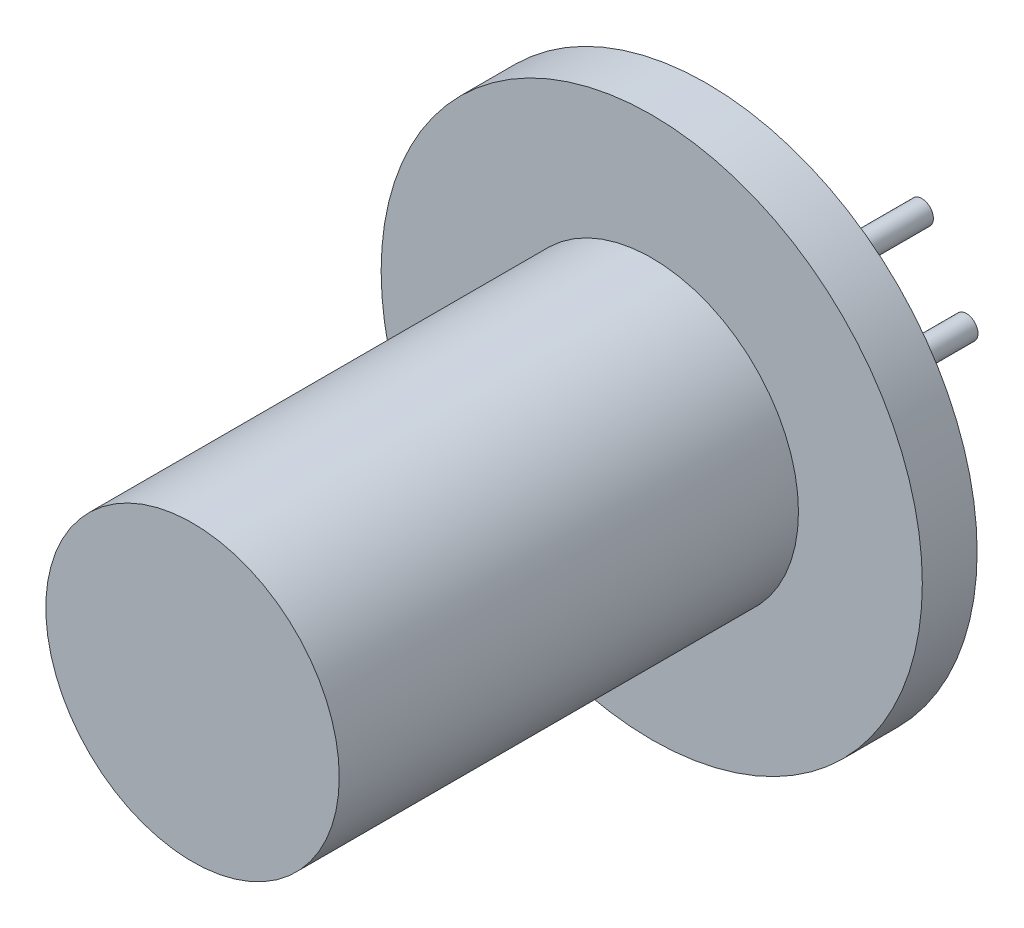
ISO-10303-21;
HEADER;
FILE_DESCRIPTION(('STEP AP214'),'2;1');
FILE_NAME('part.step','',(''),(''),'','','');
FILE_SCHEMA(('AUTOMOTIVE_DESIGN { 1 0 10303 214 1 1 1 1 }'));
ENDSEC;
DATA;
#1=APPLICATION_CONTEXT('core data for automotive mechanical design processes');
#2=APPLICATION_PROTOCOL_DEFINITION('international standard','automotive_design',2000,#1);
#3=PRODUCT_CONTEXT('',#1,'mechanical');
#4=PRODUCT('Part','Part','',(#3));
#5=PRODUCT_RELATED_PRODUCT_CATEGORY('part','',(#4));
#6=PRODUCT_DEFINITION_FORMATION('','',#4);
#7=PRODUCT_DEFINITION_CONTEXT('part definition',#1,'design');
#8=PRODUCT_DEFINITION('design','',#6,#7);
#9=PRODUCT_DEFINITION_SHAPE('','',#8);
#10=(LENGTH_UNIT() NAMED_UNIT(*) SI_UNIT(.MILLI.,.METRE.));
#11=(NAMED_UNIT(*) PLANE_ANGLE_UNIT() SI_UNIT($,.RADIAN.));
#12=(NAMED_UNIT(*) SI_UNIT($,.STERADIAN.) SOLID_ANGLE_UNIT());
#13=UNCERTAINTY_MEASURE_WITH_UNIT(LENGTH_MEASURE(1.E-05),#10,'distance_accuracy_value','');
#14=(GEOMETRIC_REPRESENTATION_CONTEXT(3) GLOBAL_UNCERTAINTY_ASSIGNED_CONTEXT((#13)) GLOBAL_UNIT_ASSIGNED_CONTEXT((#10,
#11,#12)) REPRESENTATION_CONTEXT('',''));
#15=CARTESIAN_POINT('',(0.,0.,0.));
#16=DIRECTION('',(0.,0.,1.));
#17=DIRECTION('',(1.,0.,0.));
#18=AXIS2_PLACEMENT_3D('',#15,#16,#17);
#19=CARTESIAN_POINT('',(4.318,0.,13.5128));
#20=DIRECTION('',(0.,0.,1.));
#21=DIRECTION('',(1.,0.,0.));
#22=AXIS2_PLACEMENT_3D('',#19,#20,#21);
#23=PLANE('',#22);
#24=CARTESIAN_POINT('',(0.,0.,13.5128));
#25=DIRECTION('',(0.,0.,1.));
#26=DIRECTION('',(1.,0.,0.));
#27=AXIS2_PLACEMENT_3D('',#24,#25,#26);
#28=CIRCLE('',#27,4.318);
#29=CARTESIAN_POINT('',(4.318,0.,13.5128));
#30=VERTEX_POINT('',#29);
#31=EDGE_CURVE('E72',#30,#30,#28,.T.);
#32=ORIENTED_EDGE('',*,*,#31,.T.);
#33=EDGE_LOOP('',(#32));
#34=FACE_BOUND('',#33,.T.);
#35=ADVANCED_FACE('F37',(#34),#23,.T.);
#36=CARTESIAN_POINT('',(0.,0.,-3.18516));
#37=DIRECTION('',(0.,0.,-1.));
#38=DIRECTION('',(-1.,0.,0.));
#39=AXIS2_PLACEMENT_3D('',#36,#37,#38);
#40=PLANE('',#39);
#41=CARTESIAN_POINT('',(1.31305408182695,-0.758092127603315,-3.18516));
#42=DIRECTION('',(0.,0.,-1.));
#43=DIRECTION('',(-1.,0.,0.));
#44=AXIS2_PLACEMENT_3D('',#41,#42,#43);
#45=CIRCLE('',#44,0.340929452824512);
#46=CARTESIAN_POINT('',(0.972124629002433,-0.758092127603315,-3.18516));
#47=VERTEX_POINT('',#46);
#48=EDGE_CURVE('E93',#47,#47,#45,.T.);
#49=ORIENTED_EDGE('',*,*,#48,.F.);
#50=EDGE_LOOP('',(#49));
#51=FACE_BOUND('',#50,.T.);
#52=CARTESIAN_POINT('',(-1.31305408182704,-0.758092127603384,-3.18516));
#53=DIRECTION('',(0.,0.,-1.));
#54=DIRECTION('',(-1.,0.,0.));
#55=AXIS2_PLACEMENT_3D('',#52,#53,#54);
#56=CIRCLE('',#55,0.340929452824474);
#57=CARTESIAN_POINT('',(-1.65398353465151,-0.758092127603384,-3.18516));
#58=VERTEX_POINT('',#57);
#59=EDGE_CURVE('E85',#58,#58,#56,.T.);
#60=ORIENTED_EDGE('',*,*,#59,.F.);
#61=EDGE_LOOP('',(#60));
#62=FACE_BOUND('',#61,.T.);
#63=CARTESIAN_POINT('',(-1.06019480689118E-13,1.5161842552067,-3.18516));
#64=DIRECTION('',(0.,0.,-1.));
#65=DIRECTION('',(-1.,0.,0.));
#66=AXIS2_PLACEMENT_3D('',#63,#64,#65);
#67=CIRCLE('',#66,0.34092945282439);
#68=CARTESIAN_POINT('',(-0.340929452824496,1.5161842552067,-3.18516));
#69=VERTEX_POINT('',#68);
#70=EDGE_CURVE('E77',#69,#69,#67,.T.);
#71=ORIENTED_EDGE('',*,*,#70,.F.);
#72=EDGE_LOOP('',(#71));
#73=FACE_BOUND('',#72,.T.);
#74=CARTESIAN_POINT('',(0.,0.,-3.18516));
#75=DIRECTION('',(0.,0.,1.));
#76=DIRECTION('',(1.,0.,0.));
#77=AXIS2_PLACEMENT_3D('',#74,#75,#76);
#78=CIRCLE('',#77,3.1623);
#79=CARTESIAN_POINT('',(3.1623,0.,-3.18516));
#80=VERTEX_POINT('',#79);
#81=EDGE_CURVE('E10',#80,#80,#78,.T.);
#82=ORIENTED_EDGE('',*,*,#81,.F.);
#83=EDGE_LOOP('',(#82));
#84=FACE_BOUND('',#83,.T.);
#85=ADVANCED_FACE('F110',(#51,#62,#73,#84),#40,.T.);
#86=CARTESIAN_POINT('',(0.,0.,13.5128));
#87=DIRECTION('',(0.,0.,1.));
#88=DIRECTION('',(1.,0.,0.));
#89=AXIS2_PLACEMENT_3D('',#86,#87,#88);
#90=CYLINDRICAL_SURFACE('',#89,3.1623);
#91=ORIENTED_EDGE('',*,*,#81,.T.);
#92=EDGE_LOOP('',(#91));
#93=FACE_BOUND('',#92,.T.);
#94=CARTESIAN_POINT('',(0.,0.,-3.8354));
#95=DIRECTION('',(0.,0.,1.));
#96=DIRECTION('',(1.,0.,0.));
#97=AXIS2_PLACEMENT_3D('',#94,#95,#96);
#98=CIRCLE('',#97,3.1623);
#99=CARTESIAN_POINT('',(3.1623,0.,-3.8354));
#100=VERTEX_POINT('',#99);
#101=EDGE_CURVE('E44',#100,#100,#98,.T.);
#102=ORIENTED_EDGE('',*,*,#101,.F.);
#103=EDGE_LOOP('',(#102));
#104=FACE_BOUND('',#103,.T.);
#105=ADVANCED_FACE('F113',(#93,#104),#90,.F.);
#106=CARTESIAN_POINT('',(3.1623,0.,-3.8354));
#107=DIRECTION('',(0.,0.,-1.));
#108=DIRECTION('',(-1.,0.,0.));
#109=AXIS2_PLACEMENT_3D('',#106,#107,#108);
#110=PLANE('',#109);
#111=ORIENTED_EDGE('',*,*,#101,.T.);
#112=EDGE_LOOP('',(#111));
#113=FACE_BOUND('',#112,.T.);
#114=CARTESIAN_POINT('',(0.,0.,-3.8354));
#115=DIRECTION('',(0.,0.,1.));
#116=DIRECTION('',(1.,0.,0.));
#117=AXIS2_PLACEMENT_3D('',#114,#115,#116);
#118=CIRCLE('',#117,4.2799);
#119=CARTESIAN_POINT('',(4.2799,0.,-3.8354));
#120=VERTEX_POINT('',#119);
#121=EDGE_CURVE('E49',#120,#120,#118,.T.);
#122=ORIENTED_EDGE('',*,*,#121,.F.);
#123=EDGE_LOOP('',(#122));
#124=FACE_BOUND('',#123,.T.);
#125=ADVANCED_FACE('F153',(#113,#124),#110,.T.);
#126=CARTESIAN_POINT('',(0.,0.,13.5128));
#127=DIRECTION('',(0.,0.,1.));
#128=DIRECTION('',(1.,0.,0.));
#129=AXIS2_PLACEMENT_3D('',#126,#127,#128);
#130=CYLINDRICAL_SURFACE('',#129,4.2799);
#131=ORIENTED_EDGE('',*,*,#121,.T.);
#132=EDGE_LOOP('',(#131));
#133=FACE_BOUND('',#132,.T.);
#134=CARTESIAN_POINT('',(0.,0.,-1.6129));
#135=DIRECTION('',(0.,0.,1.));
#136=DIRECTION('',(1.,0.,0.));
#137=AXIS2_PLACEMENT_3D('',#134,#135,#136);
#138=CIRCLE('',#137,4.2799);
#139=CARTESIAN_POINT('',(4.2799,0.,-1.6129));
#140=VERTEX_POINT('',#139);
#141=EDGE_CURVE('E54',#140,#140,#138,.T.);
#142=ORIENTED_EDGE('',*,*,#141,.F.);
#143=EDGE_LOOP('',(#142));
#144=FACE_BOUND('',#143,.T.);
#145=ADVANCED_FACE('F160',(#133,#144),#130,.T.);
#146=CARTESIAN_POINT('',(4.2799,0.,-1.6129));
#147=DIRECTION('',(0.,0.,-1.));
#148=DIRECTION('',(-1.,0.,0.));
#149=AXIS2_PLACEMENT_3D('',#146,#147,#148);
#150=PLANE('',#149);
#151=ORIENTED_EDGE('',*,*,#141,.T.);
#152=EDGE_LOOP('',(#151));
#153=FACE_BOUND('',#152,.T.);
#154=CARTESIAN_POINT('',(0.,0.,-1.6129));
#155=DIRECTION('',(0.,0.,1.));
#156=DIRECTION('',(1.,0.,0.));
#157=AXIS2_PLACEMENT_3D('',#154,#155,#156);
#158=CIRCLE('',#157,7.9629);
#159=CARTESIAN_POINT('',(7.9629,0.,-1.6129));
#160=VERTEX_POINT('',#159);
#161=EDGE_CURVE('E60',#160,#160,#158,.T.);
#162=ORIENTED_EDGE('',*,*,#161,.F.);
#163=EDGE_LOOP('',(#162));
#164=FACE_BOUND('',#163,.T.);
#165=ADVANCED_FACE('F167',(#153,#164),#150,.T.);
#166=CARTESIAN_POINT('',(0.,0.,13.5128));
#167=DIRECTION('',(0.,0.,1.));
#168=DIRECTION('',(1.,0.,0.));
#169=AXIS2_PLACEMENT_3D('',#166,#167,#168);
#170=CYLINDRICAL_SURFACE('',#169,7.9629);
#171=ORIENTED_EDGE('',*,*,#161,.T.);
#172=EDGE_LOOP('',(#171));
#173=FACE_BOUND('',#172,.T.);
#174=CARTESIAN_POINT('',(0.,0.,0.));
#175=DIRECTION('',(0.,0.,1.));
#176=DIRECTION('',(1.,0.,0.));
#177=AXIS2_PLACEMENT_3D('',#174,#175,#176);
#178=CIRCLE('',#177,7.9629);
#179=CARTESIAN_POINT('',(7.9629,0.,0.));
#180=VERTEX_POINT('',#179);
#181=EDGE_CURVE('E64',#180,#180,#178,.T.);
#182=ORIENTED_EDGE('',*,*,#181,.F.);
#183=EDGE_LOOP('',(#182));
#184=FACE_BOUND('',#183,.T.);
#185=ADVANCED_FACE('F175',(#173,#184),#170,.T.);
#186=CARTESIAN_POINT('',(7.9629,0.,0.));
#187=DIRECTION('',(0.,0.,1.));
#188=DIRECTION('',(1.,0.,0.));
#189=AXIS2_PLACEMENT_3D('',#186,#187,#188);
#190=PLANE('',#189);
#191=ORIENTED_EDGE('',*,*,#181,.T.);
#192=EDGE_LOOP('',(#191));
#193=FACE_BOUND('',#192,.T.);
#194=CARTESIAN_POINT('',(0.,0.,0.));
#195=DIRECTION('',(0.,0.,1.));
#196=DIRECTION('',(1.,0.,0.));
#197=AXIS2_PLACEMENT_3D('',#194,#195,#196);
#198=CIRCLE('',#197,4.318);
#199=CARTESIAN_POINT('',(4.318,0.,0.));
#200=VERTEX_POINT('',#199);
#201=EDGE_CURVE('E68',#200,#200,#198,.T.);
#202=ORIENTED_EDGE('',*,*,#201,.F.);
#203=EDGE_LOOP('',(#202));
#204=FACE_BOUND('',#203,.T.);
#205=ADVANCED_FACE('F132',(#193,#204),#190,.T.);
#206=CARTESIAN_POINT('',(0.,0.,13.5128));
#207=DIRECTION('',(0.,0.,1.));
#208=DIRECTION('',(1.,0.,0.));
#209=AXIS2_PLACEMENT_3D('',#206,#207,#208);
#210=CYLINDRICAL_SURFACE('',#209,4.318);
#211=ORIENTED_EDGE('',*,*,#201,.T.);
#212=EDGE_LOOP('',(#211));
#213=FACE_BOUND('',#212,.T.);
#214=ORIENTED_EDGE('',*,*,#31,.F.);
#215=EDGE_LOOP('',(#214));
#216=FACE_BOUND('',#215,.T.);
#217=ADVANCED_FACE('F122',(#213,#216),#210,.T.);
#218=CARTESIAN_POINT('',(-1.07547961195442E-13,1.5161842552067,-7.94766));
#219=DIRECTION('',(0.,0.,1.));
#220=DIRECTION('',(1.,0.,0.));
#221=AXIS2_PLACEMENT_3D('',#218,#219,#220);
#222=CYLINDRICAL_SURFACE('',#221,0.34092945282439);
#223=CARTESIAN_POINT('',(-1.07547961195442E-13,1.5161842552067,-7.94766));
#224=DIRECTION('',(0.,0.,-1.));
#225=DIRECTION('',(-1.,0.,0.));
#226=AXIS2_PLACEMENT_3D('',#223,#224,#225);
#227=CIRCLE('',#226,0.34092945282439);
#228=CARTESIAN_POINT('',(-0.340929452824497,1.5161842552067,-7.94766));
#229=VERTEX_POINT('',#228);
#230=EDGE_CURVE('E76',#229,#229,#227,.T.);
#231=ORIENTED_EDGE('',*,*,#230,.F.);
#232=EDGE_LOOP('',(#231));
#233=FACE_BOUND('',#232,.T.);
#234=ORIENTED_EDGE('',*,*,#70,.T.);
#235=EDGE_LOOP('',(#234));
#236=FACE_BOUND('',#235,.T.);
#237=ADVANCED_FACE('F119',(#233,#236),#222,.T.);
#238=CARTESIAN_POINT('',(-1.07547961195442E-13,1.5161842552067,-7.94766));
#239=DIRECTION('',(0.,0.,-1.));
#240=DIRECTION('',(-1.,0.,0.));
#241=AXIS2_PLACEMENT_3D('',#238,#239,#240);
#242=PLANE('',#241);
#243=ORIENTED_EDGE('',*,*,#230,.T.);
#244=EDGE_LOOP('',(#243));
#245=FACE_BOUND('',#244,.T.);
#246=ADVANCED_FACE('F121',(#245),#242,.T.);
#247=CARTESIAN_POINT('',(-1.31305408182704,-0.758092127603384,-7.94766));
#248=DIRECTION('',(0.,0.,1.));
#249=DIRECTION('',(1.,0.,0.));
#250=AXIS2_PLACEMENT_3D('',#247,#248,#249);
#251=CYLINDRICAL_SURFACE('',#250,0.340929452824474);
#252=CARTESIAN_POINT('',(-1.31305408182704,-0.758092127603384,-7.94766));
#253=DIRECTION('',(0.,0.,-1.));
#254=DIRECTION('',(-1.,0.,0.));
#255=AXIS2_PLACEMENT_3D('',#252,#253,#254);
#256=CIRCLE('',#255,0.340929452824474);
#257=CARTESIAN_POINT('',(-1.65398353465151,-0.758092127603384,-7.94766));
#258=VERTEX_POINT('',#257);
#259=EDGE_CURVE('E81',#258,#258,#256,.T.);
#260=ORIENTED_EDGE('',*,*,#259,.F.);
#261=EDGE_LOOP('',(#260));
#262=FACE_BOUND('',#261,.T.);
#263=ORIENTED_EDGE('',*,*,#59,.T.);
#264=EDGE_LOOP('',(#263));
#265=FACE_BOUND('',#264,.T.);
#266=ADVANCED_FACE('F129',(#262,#265),#251,.T.);
#267=CARTESIAN_POINT('',(-1.31305408182704,-0.758092127603384,-7.94766));
#268=DIRECTION('',(0.,0.,-1.));
#269=DIRECTION('',(-1.,0.,0.));
#270=AXIS2_PLACEMENT_3D('',#267,#268,#269);
#271=PLANE('',#270);
#272=ORIENTED_EDGE('',*,*,#259,.T.);
#273=EDGE_LOOP('',(#272));
#274=FACE_BOUND('',#273,.T.);
#275=ADVANCED_FACE('F106',(#274),#271,.T.);
#276=CARTESIAN_POINT('',(1.31305408182694,-0.758092127603315,-7.94766));
#277=DIRECTION('',(0.,0.,1.));
#278=DIRECTION('',(1.,0.,0.));
#279=AXIS2_PLACEMENT_3D('',#276,#277,#278);
#280=CYLINDRICAL_SURFACE('',#279,0.340929452824512);
#281=CARTESIAN_POINT('',(1.31305408182694,-0.758092127603315,-7.94766));
#282=DIRECTION('',(0.,0.,-1.));
#283=DIRECTION('',(-1.,0.,0.));
#284=AXIS2_PLACEMENT_3D('',#281,#282,#283);
#285=CIRCLE('',#284,0.340929452824512);
#286=CARTESIAN_POINT('',(0.972124629002431,-0.758092127603315,-7.94766));
#287=VERTEX_POINT('',#286);
#288=EDGE_CURVE('E89',#287,#287,#285,.T.);
#289=ORIENTED_EDGE('',*,*,#288,.F.);
#290=EDGE_LOOP('',(#289));
#291=FACE_BOUND('',#290,.T.);
#292=ORIENTED_EDGE('',*,*,#48,.T.);
#293=EDGE_LOOP('',(#292));
#294=FACE_BOUND('',#293,.T.);
#295=ADVANCED_FACE('F103',(#291,#294),#280,.T.);
#296=CARTESIAN_POINT('',(1.31305408182694,-0.758092127603315,-7.94766));
#297=DIRECTION('',(0.,0.,-1.));
#298=DIRECTION('',(-1.,0.,0.));
#299=AXIS2_PLACEMENT_3D('',#296,#297,#298);
#300=PLANE('',#299);
#301=ORIENTED_EDGE('',*,*,#288,.T.);
#302=EDGE_LOOP('',(#301));
#303=FACE_BOUND('',#302,.T.);
#304=ADVANCED_FACE('F101',(#303),#300,.T.);
#305=CLOSED_SHELL('',(#35,#85,#105,#125,#145,#165,#185,#205,#217,#237,#246,#266,#275,#295,#304));
#306=MANIFOLD_SOLID_BREP('B2',#305);
#307=ADVANCED_BREP_SHAPE_REPRESENTATION('',(#18,#306),#14);
#308=SHAPE_DEFINITION_REPRESENTATION(#9,#307);
ENDSEC;
END-ISO-10303-21;
